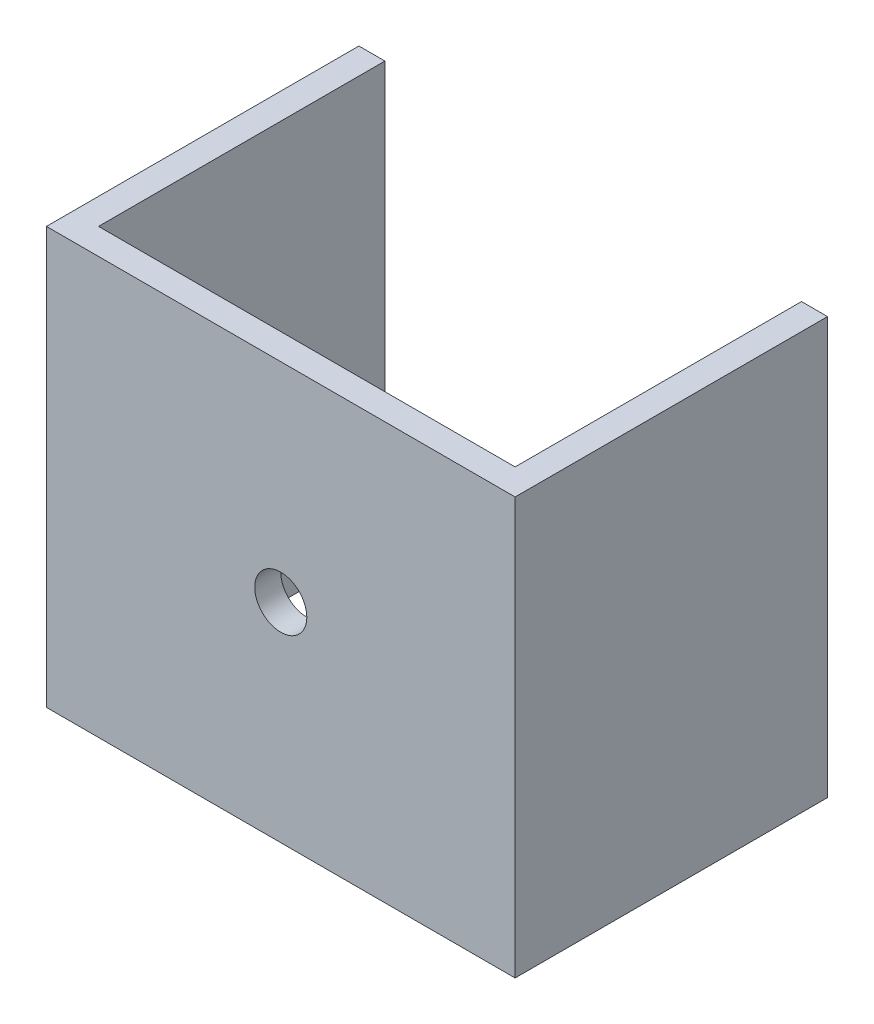
ISO-10303-21;
HEADER;
FILE_DESCRIPTION(('STEP AP214'),'2;1');
FILE_NAME('part.step','',(''),(''),'','','');
FILE_SCHEMA(('AUTOMOTIVE_DESIGN { 1 0 10303 214 1 1 1 1 }'));
ENDSEC;
DATA;
#1=APPLICATION_CONTEXT('core data for automotive mechanical design processes');
#2=APPLICATION_PROTOCOL_DEFINITION('international standard','automotive_design',2000,#1);
#3=PRODUCT_CONTEXT('',#1,'mechanical');
#4=PRODUCT('Part','Part','',(#3));
#5=PRODUCT_RELATED_PRODUCT_CATEGORY('part','',(#4));
#6=PRODUCT_DEFINITION_FORMATION('','',#4);
#7=PRODUCT_DEFINITION_CONTEXT('part definition',#1,'design');
#8=PRODUCT_DEFINITION('design','',#6,#7);
#9=PRODUCT_DEFINITION_SHAPE('','',#8);
#10=(LENGTH_UNIT() NAMED_UNIT(*) SI_UNIT(.MILLI.,.METRE.));
#11=(NAMED_UNIT(*) PLANE_ANGLE_UNIT() SI_UNIT($,.RADIAN.));
#12=(NAMED_UNIT(*) SI_UNIT($,.STERADIAN.) SOLID_ANGLE_UNIT());
#13=UNCERTAINTY_MEASURE_WITH_UNIT(LENGTH_MEASURE(1.E-05),#10,'distance_accuracy_value','');
#14=(GEOMETRIC_REPRESENTATION_CONTEXT(3) GLOBAL_UNCERTAINTY_ASSIGNED_CONTEXT((#13)) GLOBAL_UNIT_ASSIGNED_CONTEXT((#10,
#11,#12)) REPRESENTATION_CONTEXT('',''));
#15=CARTESIAN_POINT('',(0.,0.,0.));
#16=DIRECTION('',(0.,0.,1.));
#17=DIRECTION('',(1.,0.,0.));
#18=AXIS2_PLACEMENT_3D('',#15,#16,#17);
#19=CARTESIAN_POINT('',(0.,50.8,0.));
#20=DIRECTION('',(1.,0.,0.));
#21=DIRECTION('',(0.,0.,-1.));
#22=AXIS2_PLACEMENT_3D('',#19,#20,#21);
#23=PLANE('',#22);
#24=DIRECTION('',(0.,0.,1.));
#25=VECTOR('',#24,1.);
#26=CARTESIAN_POINT('',(0.,0.,0.));
#27=LINE('',#26,#25);
#28=CARTESIAN_POINT('',(0.,0.,-38.1));
#29=VERTEX_POINT('',#28);
#30=CARTESIAN_POINT('',(0.,0.,0.));
#31=VERTEX_POINT('',#30);
#32=EDGE_CURVE('E130',#29,#31,#27,.T.);
#33=ORIENTED_EDGE('',*,*,#32,.T.);
#34=DIRECTION('',(0.,-1.,0.));
#35=VECTOR('',#34,1.);
#36=CARTESIAN_POINT('',(0.,50.8,0.));
#37=LINE('',#36,#35);
#38=CARTESIAN_POINT('',(0.,50.8,0.));
#39=VERTEX_POINT('',#38);
#40=EDGE_CURVE('E11',#39,#31,#37,.T.);
#41=ORIENTED_EDGE('',*,*,#40,.F.);
#42=DIRECTION('',(0.,0.,1.));
#43=VECTOR('',#42,1.);
#44=CARTESIAN_POINT('',(0.,50.8,0.));
#45=LINE('',#44,#43);
#46=CARTESIAN_POINT('',(0.,50.8,-38.1));
#47=VERTEX_POINT('',#46);
#48=EDGE_CURVE('E144',#47,#39,#45,.T.);
#49=ORIENTED_EDGE('',*,*,#48,.F.);
#50=DIRECTION('',(0.,-1.,0.));
#51=VECTOR('',#50,1.);
#52=CARTESIAN_POINT('',(0.,50.8,-38.1));
#53=LINE('',#52,#51);
#54=EDGE_CURVE('E126',#47,#29,#53,.T.);
#55=ORIENTED_EDGE('',*,*,#54,.T.);
#56=EDGE_LOOP('',(#33,#41,#49,#55));
#57=FACE_BOUND('',#56,.T.);
#58=ADVANCED_FACE('F33',(#57),#23,.F.);
#59=CARTESIAN_POINT('',(0.,50.8,0.));
#60=DIRECTION('',(0.,0.,-1.));
#61=DIRECTION('',(-1.,0.,0.));
#62=AXIS2_PLACEMENT_3D('',#59,#60,#61);
#63=PLANE('',#62);
#64=CARTESIAN_POINT('',(28.575,25.4000000000001,0.));
#65=DIRECTION('',(0.,0.,1.));
#66=DIRECTION('',(1.,0.,0.));
#67=AXIS2_PLACEMENT_3D('',#64,#65,#66);
#68=CIRCLE('',#67,3.175);
#69=CARTESIAN_POINT('',(31.75,25.4000000000001,0.));
#70=VERTEX_POINT('',#69);
#71=EDGE_CURVE('E178',#70,#70,#68,.T.);
#72=ORIENTED_EDGE('',*,*,#71,.F.);
#73=EDGE_LOOP('',(#72));
#74=FACE_BOUND('',#73,.T.);
#75=DIRECTION('',(1.,0.,0.));
#76=VECTOR('',#75,1.);
#77=CARTESIAN_POINT('',(0.,0.,0.));
#78=LINE('',#77,#76);
#79=CARTESIAN_POINT('',(57.15,0.,0.));
#80=VERTEX_POINT('',#79);
#81=EDGE_CURVE('E133',#31,#80,#78,.T.);
#82=ORIENTED_EDGE('',*,*,#81,.T.);
#83=DIRECTION('',(0.,-1.,0.));
#84=VECTOR('',#83,1.);
#85=CARTESIAN_POINT('',(57.15,50.8,0.));
#86=LINE('',#85,#84);
#87=CARTESIAN_POINT('',(57.15,50.8,0.));
#88=VERTEX_POINT('',#87);
#89=EDGE_CURVE('E42',#88,#80,#86,.T.);
#90=ORIENTED_EDGE('',*,*,#89,.F.);
#91=DIRECTION('',(1.,0.,0.));
#92=VECTOR('',#91,1.);
#93=CARTESIAN_POINT('',(0.,50.8,0.));
#94=LINE('',#93,#92);
#95=EDGE_CURVE('E93',#39,#88,#94,.T.);
#96=ORIENTED_EDGE('',*,*,#95,.F.);
#97=ORIENTED_EDGE('',*,*,#40,.T.);
#98=EDGE_LOOP('',(#82,#90,#96,#97));
#99=FACE_BOUND('',#98,.T.);
#100=ADVANCED_FACE('F195',(#74,#99),#63,.F.);
#101=CARTESIAN_POINT('',(57.15,50.8,0.));
#102=DIRECTION('',(-1.,0.,0.));
#103=DIRECTION('',(0.,0.,1.));
#104=AXIS2_PLACEMENT_3D('',#101,#102,#103);
#105=PLANE('',#104);
#106=DIRECTION('',(0.,0.,-1.));
#107=VECTOR('',#106,1.);
#108=CARTESIAN_POINT('',(57.15,0.,0.));
#109=LINE('',#108,#107);
#110=CARTESIAN_POINT('',(57.15,0.,-38.1));
#111=VERTEX_POINT('',#110);
#112=EDGE_CURVE('E135',#80,#111,#109,.T.);
#113=ORIENTED_EDGE('',*,*,#112,.T.);
#114=DIRECTION('',(0.,-1.,0.));
#115=VECTOR('',#114,1.);
#116=CARTESIAN_POINT('',(57.15,50.8,-38.1));
#117=LINE('',#116,#115);
#118=CARTESIAN_POINT('',(57.15,50.8,-38.1));
#119=VERTEX_POINT('',#118);
#120=EDGE_CURVE('E151',#119,#111,#117,.T.);
#121=ORIENTED_EDGE('',*,*,#120,.F.);
#122=DIRECTION('',(0.,0.,-1.));
#123=VECTOR('',#122,1.);
#124=CARTESIAN_POINT('',(57.15,50.8,0.));
#125=LINE('',#124,#123);
#126=EDGE_CURVE('E160',#88,#119,#125,.T.);
#127=ORIENTED_EDGE('',*,*,#126,.F.);
#128=ORIENTED_EDGE('',*,*,#89,.T.);
#129=EDGE_LOOP('',(#113,#121,#127,#128));
#130=FACE_BOUND('',#129,.T.);
#131=ADVANCED_FACE('F158',(#130),#105,.F.);
#132=CARTESIAN_POINT('',(53.975,50.8,-38.1));
#133=DIRECTION('',(0.,0.,1.));
#134=DIRECTION('',(1.,0.,0.));
#135=AXIS2_PLACEMENT_3D('',#132,#133,#134);
#136=PLANE('',#135);
#137=DIRECTION('',(-1.,0.,0.));
#138=VECTOR('',#137,1.);
#139=CARTESIAN_POINT('',(53.975,0.,-38.1));
#140=LINE('',#139,#138);
#141=CARTESIAN_POINT('',(53.975,0.,-38.1));
#142=VERTEX_POINT('',#141);
#143=EDGE_CURVE('E137',#111,#142,#140,.T.);
#144=ORIENTED_EDGE('',*,*,#143,.T.);
#145=DIRECTION('',(0.,-1.,0.));
#146=VECTOR('',#145,1.);
#147=CARTESIAN_POINT('',(53.975,50.8,-38.1));
#148=LINE('',#147,#146);
#149=CARTESIAN_POINT('',(53.975,50.8,-38.1));
#150=VERTEX_POINT('',#149);
#151=EDGE_CURVE('E148',#150,#142,#148,.T.);
#152=ORIENTED_EDGE('',*,*,#151,.F.);
#153=DIRECTION('',(-1.,0.,0.));
#154=VECTOR('',#153,1.);
#155=CARTESIAN_POINT('',(53.975,50.8,-38.1));
#156=LINE('',#155,#154);
#157=EDGE_CURVE('E172',#119,#150,#156,.T.);
#158=ORIENTED_EDGE('',*,*,#157,.F.);
#159=ORIENTED_EDGE('',*,*,#120,.T.);
#160=EDGE_LOOP('',(#144,#152,#158,#159));
#161=FACE_BOUND('',#160,.T.);
#162=ADVANCED_FACE('F168',(#161),#136,.F.);
#163=CARTESIAN_POINT('',(53.975,50.8,-38.1));
#164=DIRECTION('',(1.,0.,0.));
#165=DIRECTION('',(0.,0.,-1.));
#166=AXIS2_PLACEMENT_3D('',#163,#164,#165);
#167=PLANE('',#166);
#168=DIRECTION('',(0.,0.,1.));
#169=VECTOR('',#168,1.);
#170=CARTESIAN_POINT('',(53.975,0.,-38.1));
#171=LINE('',#170,#169);
#172=CARTESIAN_POINT('',(53.975,0.,-3.175));
#173=VERTEX_POINT('',#172);
#174=EDGE_CURVE('E139',#142,#173,#171,.T.);
#175=ORIENTED_EDGE('',*,*,#174,.T.);
#176=DIRECTION('',(0.,-1.,0.));
#177=VECTOR('',#176,1.);
#178=CARTESIAN_POINT('',(53.975,50.8,-3.175));
#179=LINE('',#178,#177);
#180=CARTESIAN_POINT('',(53.975,50.8,-3.175));
#181=VERTEX_POINT('',#180);
#182=EDGE_CURVE('E121',#181,#173,#179,.T.);
#183=ORIENTED_EDGE('',*,*,#182,.F.);
#184=DIRECTION('',(0.,0.,1.));
#185=VECTOR('',#184,1.);
#186=CARTESIAN_POINT('',(53.975,50.8,-38.1));
#187=LINE('',#186,#185);
#188=EDGE_CURVE('E112',#150,#181,#187,.T.);
#189=ORIENTED_EDGE('',*,*,#188,.F.);
#190=ORIENTED_EDGE('',*,*,#151,.T.);
#191=EDGE_LOOP('',(#175,#183,#189,#190));
#192=FACE_BOUND('',#191,.T.);
#193=ADVANCED_FACE('F171',(#192),#167,.F.);
#194=CARTESIAN_POINT('',(3.17500000000001,50.8,-3.175));
#195=DIRECTION('',(0.,0.,1.));
#196=DIRECTION('',(1.,0.,0.));
#197=AXIS2_PLACEMENT_3D('',#194,#195,#196);
#198=PLANE('',#197);
#199=CARTESIAN_POINT('',(28.575,25.4000000000001,-3.175));
#200=DIRECTION('',(0.,0.,1.));
#201=DIRECTION('',(1.,0.,0.));
#202=AXIS2_PLACEMENT_3D('',#199,#200,#201);
#203=CIRCLE('',#202,3.175);
#204=CARTESIAN_POINT('',(31.75,25.4000000000001,-3.175));
#205=VERTEX_POINT('',#204);
#206=EDGE_CURVE('E36',#205,#205,#203,.T.);
#207=ORIENTED_EDGE('',*,*,#206,.T.);
#208=EDGE_LOOP('',(#207));
#209=FACE_BOUND('',#208,.T.);
#210=DIRECTION('',(-1.,0.,0.));
#211=VECTOR('',#210,1.);
#212=CARTESIAN_POINT('',(3.17500000000001,0.,-3.175));
#213=LINE('',#212,#211);
#214=CARTESIAN_POINT('',(3.17500000000001,0.,-3.175));
#215=VERTEX_POINT('',#214);
#216=EDGE_CURVE('E120',#173,#215,#213,.T.);
#217=ORIENTED_EDGE('',*,*,#216,.T.);
#218=DIRECTION('',(0.,-1.,0.));
#219=VECTOR('',#218,1.);
#220=CARTESIAN_POINT('',(3.17500000000001,50.8,-3.175));
#221=LINE('',#220,#219);
#222=CARTESIAN_POINT('',(3.17500000000001,50.8,-3.175));
#223=VERTEX_POINT('',#222);
#224=EDGE_CURVE('E117',#223,#215,#221,.T.);
#225=ORIENTED_EDGE('',*,*,#224,.F.);
#226=DIRECTION('',(-1.,0.,0.));
#227=VECTOR('',#226,1.);
#228=CARTESIAN_POINT('',(3.17500000000001,50.8,-3.175));
#229=LINE('',#228,#227);
#230=EDGE_CURVE('E106',#181,#223,#229,.T.);
#231=ORIENTED_EDGE('',*,*,#230,.F.);
#232=ORIENTED_EDGE('',*,*,#182,.T.);
#233=EDGE_LOOP('',(#217,#225,#231,#232));
#234=FACE_BOUND('',#233,.T.);
#235=ADVANCED_FACE('F118',(#209,#234),#198,.F.);
#236=CARTESIAN_POINT('',(3.175,50.8,-38.1));
#237=DIRECTION('',(-1.,0.,0.));
#238=DIRECTION('',(0.,0.,1.));
#239=AXIS2_PLACEMENT_3D('',#236,#237,#238);
#240=PLANE('',#239);
#241=DIRECTION('',(0.,0.,-1.));
#242=VECTOR('',#241,1.);
#243=CARTESIAN_POINT('',(3.175,0.,-38.1));
#244=LINE('',#243,#242);
#245=CARTESIAN_POINT('',(3.175,0.,-38.1));
#246=VERTEX_POINT('',#245);
#247=EDGE_CURVE('E79',#215,#246,#244,.T.);
#248=ORIENTED_EDGE('',*,*,#247,.T.);
#249=DIRECTION('',(0.,-1.,0.));
#250=VECTOR('',#249,1.);
#251=CARTESIAN_POINT('',(3.175,50.8,-38.1));
#252=LINE('',#251,#250);
#253=CARTESIAN_POINT('',(3.175,50.8,-38.1));
#254=VERTEX_POINT('',#253);
#255=EDGE_CURVE('E122',#254,#246,#252,.T.);
#256=ORIENTED_EDGE('',*,*,#255,.F.);
#257=DIRECTION('',(0.,0.,-1.));
#258=VECTOR('',#257,1.);
#259=CARTESIAN_POINT('',(3.175,50.8,-38.1));
#260=LINE('',#259,#258);
#261=EDGE_CURVE('E110',#223,#254,#260,.T.);
#262=ORIENTED_EDGE('',*,*,#261,.F.);
#263=ORIENTED_EDGE('',*,*,#224,.T.);
#264=EDGE_LOOP('',(#248,#256,#262,#263));
#265=FACE_BOUND('',#264,.T.);
#266=ADVANCED_FACE('F124',(#265),#240,.F.);
#267=CARTESIAN_POINT('',(0.,50.8,-38.1));
#268=DIRECTION('',(0.,0.,1.));
#269=DIRECTION('',(1.,0.,0.));
#270=AXIS2_PLACEMENT_3D('',#267,#268,#269);
#271=PLANE('',#270);
#272=DIRECTION('',(-1.,0.,0.));
#273=VECTOR('',#272,1.);
#274=CARTESIAN_POINT('',(0.,0.,-38.1));
#275=LINE('',#274,#273);
#276=EDGE_CURVE('E85',#246,#29,#275,.T.);
#277=ORIENTED_EDGE('',*,*,#276,.T.);
#278=ORIENTED_EDGE('',*,*,#54,.F.);
#279=DIRECTION('',(-1.,0.,0.));
#280=VECTOR('',#279,1.);
#281=CARTESIAN_POINT('',(0.,50.8,-38.1));
#282=LINE('',#281,#280);
#283=EDGE_CURVE('E50',#254,#47,#282,.T.);
#284=ORIENTED_EDGE('',*,*,#283,.F.);
#285=ORIENTED_EDGE('',*,*,#255,.T.);
#286=EDGE_LOOP('',(#277,#278,#284,#285));
#287=FACE_BOUND('',#286,.T.);
#288=ADVANCED_FACE('F203',(#287),#271,.F.);
#289=CARTESIAN_POINT('',(0.,50.8,0.));
#290=DIRECTION('',(0.,-1.,0.));
#291=DIRECTION('',(0.,0.,-1.));
#292=AXIS2_PLACEMENT_3D('',#289,#290,#291);
#293=PLANE('',#292);
#294=ORIENTED_EDGE('',*,*,#48,.T.);
#295=ORIENTED_EDGE('',*,*,#95,.T.);
#296=ORIENTED_EDGE('',*,*,#126,.T.);
#297=ORIENTED_EDGE('',*,*,#157,.T.);
#298=ORIENTED_EDGE('',*,*,#188,.T.);
#299=ORIENTED_EDGE('',*,*,#230,.T.);
#300=ORIENTED_EDGE('',*,*,#261,.T.);
#301=ORIENTED_EDGE('',*,*,#283,.T.);
#302=EDGE_LOOP('',(#294,#295,#296,#297,#298,#299,#300,#301));
#303=FACE_BOUND('',#302,.T.);
#304=ADVANCED_FACE('F108',(#303),#293,.F.);
#305=CARTESIAN_POINT('',(0.,0.,0.));
#306=DIRECTION('',(0.,-1.,0.));
#307=DIRECTION('',(0.,0.,-1.));
#308=AXIS2_PLACEMENT_3D('',#305,#306,#307);
#309=PLANE('',#308);
#310=ORIENTED_EDGE('',*,*,#32,.F.);
#311=ORIENTED_EDGE('',*,*,#276,.F.);
#312=ORIENTED_EDGE('',*,*,#247,.F.);
#313=ORIENTED_EDGE('',*,*,#216,.F.);
#314=ORIENTED_EDGE('',*,*,#174,.F.);
#315=ORIENTED_EDGE('',*,*,#143,.F.);
#316=ORIENTED_EDGE('',*,*,#112,.F.);
#317=ORIENTED_EDGE('',*,*,#81,.F.);
#318=EDGE_LOOP('',(#310,#311,#312,#313,#314,#315,#316,#317));
#319=FACE_BOUND('',#318,.T.);
#320=ADVANCED_FACE('F164',(#319),#309,.T.);
#321=CARTESIAN_POINT('',(28.575,25.4000000000001,-38.1));
#322=DIRECTION('',(0.,0.,1.));
#323=DIRECTION('',(1.,0.,0.));
#324=AXIS2_PLACEMENT_3D('',#321,#322,#323);
#325=CYLINDRICAL_SURFACE('',#324,3.175);
#326=CARTESIAN_POINT('',(31.75,25.4000000000001,0.));
#327=CARTESIAN_POINT('',(31.75,25.4000000000001,-0.0330729166666659));
#328=CARTESIAN_POINT('',(31.75,25.4000000000001,-0.0661458333333318));
#329=CARTESIAN_POINT('',(31.75,25.4000000000001,-0.132291666666666));
#330=CARTESIAN_POINT('',(31.75,25.4000000000001,-0.165364583333334));
#331=CARTESIAN_POINT('',(31.75,25.4000000000001,-0.231510416666668));
#332=CARTESIAN_POINT('',(31.75,25.4000000000001,-0.264583333333334));
#333=CARTESIAN_POINT('',(31.75,25.4000000000001,-0.330729166666666));
#334=CARTESIAN_POINT('',(31.75,25.4000000000001,-0.363802083333332));
#335=CARTESIAN_POINT('',(31.75,25.4000000000001,-0.429947916666666));
#336=CARTESIAN_POINT('',(31.75,25.4000000000001,-0.463020833333334));
#337=CARTESIAN_POINT('',(31.75,25.4000000000001,-0.529166666666669));
#338=CARTESIAN_POINT('',(31.75,25.4000000000001,-0.562239583333334));
#339=CARTESIAN_POINT('',(31.75,25.4000000000001,-0.628385416666666));
#340=CARTESIAN_POINT('',(31.75,25.4000000000001,-0.661458333333332));
#341=CARTESIAN_POINT('',(31.75,25.4000000000001,-0.727604166666664));
#342=CARTESIAN_POINT('',(31.75,25.4000000000001,-0.76067708333333));
#343=CARTESIAN_POINT('',(31.75,25.4000000000001,-0.826822916666664));
#344=CARTESIAN_POINT('',(31.75,25.4000000000001,-0.859895833333332));
#345=CARTESIAN_POINT('',(31.75,25.4000000000001,-0.926041666666666));
#346=CARTESIAN_POINT('',(31.75,25.4000000000001,-0.959114583333332));
#347=CARTESIAN_POINT('',(31.75,25.4000000000001,-1.02526041666666));
#348=CARTESIAN_POINT('',(31.75,25.4000000000001,-1.05833333333333));
#349=CARTESIAN_POINT('',(31.75,25.4000000000001,-1.12447916666666));
#350=CARTESIAN_POINT('',(31.75,25.4000000000001,-1.15755208333333));
#351=CARTESIAN_POINT('',(31.75,25.4000000000001,-1.22369791666667));
#352=CARTESIAN_POINT('',(31.75,25.4000000000001,-1.25677083333333));
#353=CARTESIAN_POINT('',(31.75,25.4000000000001,-1.32291666666666));
#354=CARTESIAN_POINT('',(31.75,25.4000000000001,-1.35598958333333));
#355=CARTESIAN_POINT('',(31.75,25.4000000000001,-1.42213541666666));
#356=CARTESIAN_POINT('',(31.75,25.4000000000001,-1.45520833333333));
#357=CARTESIAN_POINT('',(31.75,25.4000000000001,-1.52135416666667));
#358=CARTESIAN_POINT('',(31.75,25.4000000000001,-1.55442708333333));
#359=CARTESIAN_POINT('',(31.75,25.4000000000001,-1.62057291666666));
#360=CARTESIAN_POINT('',(31.75,25.4000000000001,-1.65364583333333));
#361=CARTESIAN_POINT('',(31.75,25.4000000000001,-1.71979166666666));
#362=CARTESIAN_POINT('',(31.75,25.4000000000001,-1.75286458333333));
#363=CARTESIAN_POINT('',(31.75,25.4000000000001,-1.81901041666667));
#364=CARTESIAN_POINT('',(31.75,25.4000000000001,-1.85208333333333));
#365=CARTESIAN_POINT('',(31.75,25.4000000000001,-1.91822916666666));
#366=CARTESIAN_POINT('',(31.75,25.4000000000001,-1.95130208333333));
#367=CARTESIAN_POINT('',(31.75,25.4000000000001,-2.01744791666667));
#368=CARTESIAN_POINT('',(31.75,25.4000000000001,-2.05052083333333));
#369=CARTESIAN_POINT('',(31.75,25.4000000000001,-2.11666666666667));
#370=CARTESIAN_POINT('',(31.75,25.4000000000001,-2.14973958333333));
#371=CARTESIAN_POINT('',(31.75,25.4000000000001,-2.21588541666666));
#372=CARTESIAN_POINT('',(31.75,25.4000000000001,-2.24895833333333));
#373=CARTESIAN_POINT('',(31.75,25.4000000000001,-2.31510416666667));
#374=CARTESIAN_POINT('',(31.75,25.4000000000001,-2.34817708333333));
#375=CARTESIAN_POINT('',(31.75,25.4000000000001,-2.41432291666667));
#376=CARTESIAN_POINT('',(31.75,25.4000000000001,-2.44739583333333));
#377=CARTESIAN_POINT('',(31.75,25.4000000000001,-2.51354166666667));
#378=CARTESIAN_POINT('',(31.75,25.4000000000001,-2.54661458333333));
#379=CARTESIAN_POINT('',(31.75,25.4000000000001,-2.61276041666666));
#380=CARTESIAN_POINT('',(31.75,25.4000000000001,-2.64583333333333));
#381=CARTESIAN_POINT('',(31.75,25.4000000000001,-2.71197916666666));
#382=CARTESIAN_POINT('',(31.75,25.4000000000001,-2.74505208333333));
#383=CARTESIAN_POINT('',(31.75,25.4000000000001,-2.81119791666667));
#384=CARTESIAN_POINT('',(31.75,25.4000000000001,-2.84427083333333));
#385=CARTESIAN_POINT('',(31.75,25.4000000000001,-2.91041666666666));
#386=CARTESIAN_POINT('',(31.75,25.4000000000001,-2.94348958333333));
#387=CARTESIAN_POINT('',(31.75,25.4000000000001,-3.00963541666666));
#388=CARTESIAN_POINT('',(31.75,25.4000000000001,-3.04270833333333));
#389=CARTESIAN_POINT('',(31.75,25.4000000000001,-3.10885416666667));
#390=CARTESIAN_POINT('',(31.75,25.4000000000001,-3.14192708333333));
#391=CARTESIAN_POINT('',(31.75,25.4000000000001,-3.175));
#392=B_SPLINE_CURVE_WITH_KNOTS('',3,(#326,#327,#328,#329,#330,#331,#332,#333,#334,#335,#336,
#337,#338,#339,#340,#341,#342,#343,#344,#345,#346,#347,#348,#349,#350,#351,#352,#353,#354,#355,
#356,#357,#358,#359,#360,#361,#362,#363,#364,#365,#366,#367,#368,#369,#370,#371,#372,#373,#374,
#375,#376,#377,#378,#379,#380,#381,#382,#383,#384,#385,#386,#387,#388,#389,#390,#391),
.UNSPECIFIED.,.F.,.F.,(4,2,2,2,2,2,2,2,2,2,2,2,2,2,2,2,2,2,2,2,2,2,2,2,2,2,2,2,2,2,2,2,4),(0.,
0.0992187499999977,0.198437500000002,0.29765625,0.396874999999998,0.496093750000003,0.5953125,
0.694531249999998,0.793749999999996,0.892968750000001,0.992187499999998,1.09140625,1.190625,
1.28984375,1.3890625,1.48828125,1.5875,1.68671875,1.7859375,1.88515625,1.984375,2.08359375,
2.1828125,2.28203125,2.38125,2.48046875,2.5796875,2.67890624999999,2.778125,2.87734375,
2.97656249999999,3.07578125,3.175),.UNSPECIFIED.);
#393=EDGE_CURVE('BSEAM186',#70,#205,#392,.T.);
#394=ORIENTED_EDGE('',*,*,#71,.T.);
#395=ORIENTED_EDGE('',*,*,#206,.F.);
#396=ORIENTED_EDGE('',*,*,#393,.T.);
#397=ORIENTED_EDGE('',*,*,#393,.F.);
#398=EDGE_LOOP('',(#394,#396,#395,#397));
#399=FACE_BOUND('',#398,.T.);
#400=ADVANCED_FACE('F186',(#399),#325,.F.);
#401=CLOSED_SHELL('',(#58,#100,#131,#162,#193,#235,#266,#288,#304,#320,#400));
#402=MANIFOLD_SOLID_BREP('B2',#401);
#403=ADVANCED_BREP_SHAPE_REPRESENTATION('',(#18,#402),#14);
#404=SHAPE_DEFINITION_REPRESENTATION(#9,#403);
ENDSEC;
END-ISO-10303-21;
